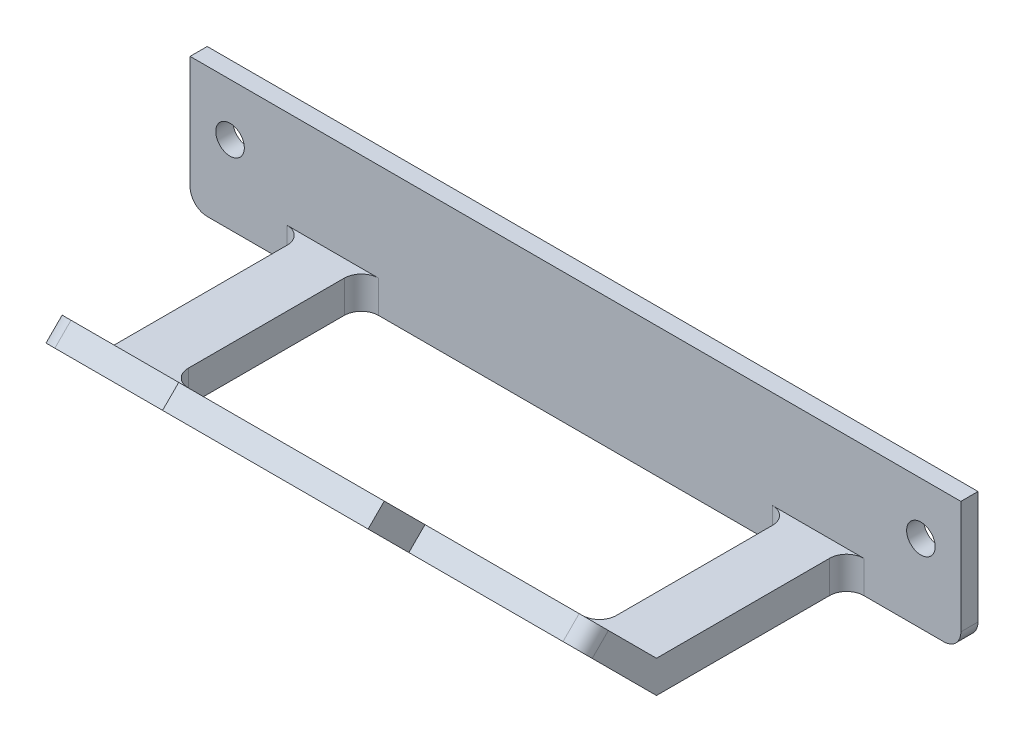
ISO-10303-21;
HEADER;
FILE_DESCRIPTION(('STEP AP214'),'2;1');
FILE_NAME('part.step','',(''),(''),'','','');
FILE_SCHEMA(('AUTOMOTIVE_DESIGN { 1 0 10303 214 1 1 1 1 }'));
ENDSEC;
DATA;
#1=APPLICATION_CONTEXT('core data for automotive mechanical design processes');
#2=APPLICATION_PROTOCOL_DEFINITION('international standard','automotive_design',2000,#1);
#3=PRODUCT_CONTEXT('',#1,'mechanical');
#4=PRODUCT('Part','Part','',(#3));
#5=PRODUCT_RELATED_PRODUCT_CATEGORY('part','',(#4));
#6=PRODUCT_DEFINITION_FORMATION('','',#4);
#7=PRODUCT_DEFINITION_CONTEXT('part definition',#1,'design');
#8=PRODUCT_DEFINITION('design','',#6,#7);
#9=PRODUCT_DEFINITION_SHAPE('','',#8);
#10=(LENGTH_UNIT() NAMED_UNIT(*) SI_UNIT(.MILLI.,.METRE.));
#11=(NAMED_UNIT(*) PLANE_ANGLE_UNIT() SI_UNIT($,.RADIAN.));
#12=(NAMED_UNIT(*) SI_UNIT($,.STERADIAN.) SOLID_ANGLE_UNIT());
#13=UNCERTAINTY_MEASURE_WITH_UNIT(LENGTH_MEASURE(1.E-05),#10,'distance_accuracy_value','');
#14=(GEOMETRIC_REPRESENTATION_CONTEXT(3) GLOBAL_UNCERTAINTY_ASSIGNED_CONTEXT((#13)) GLOBAL_UNIT_ASSIGNED_CONTEXT((#10,
#11,#12)) REPRESENTATION_CONTEXT('',''));
#15=CARTESIAN_POINT('',(0.,0.,0.));
#16=DIRECTION('',(0.,0.,1.));
#17=DIRECTION('',(1.,0.,0.));
#18=AXIS2_PLACEMENT_3D('',#15,#16,#17);
#19=CARTESIAN_POINT('',(35.,18.4852813742386,9.48528137423858));
#20=DIRECTION('',(0.,-1.,0.));
#21=DIRECTION('',(1.,0.,0.));
#22=AXIS2_PLACEMENT_3D('',#19,#20,#21);
#23=CYLINDRICAL_SURFACE('',#22,3.);
#24=DIRECTION('',(0.,1.,0.));
#25=VECTOR('',#24,1.);
#26=CARTESIAN_POINT('',(38.,18.4852813742386,9.48528137423858));
#27=LINE('',#26,#25);
#28=CARTESIAN_POINT('',(38.,18.4852813742386,9.48528137423858));
#29=VERTEX_POINT('',#28);
#30=CARTESIAN_POINT('',(38.,24.1421356237309,9.48528137423858));
#31=VERTEX_POINT('',#30);
#32=EDGE_CURVE('E543',#29,#31,#27,.T.);
#33=ORIENTED_EDGE('',*,*,#32,.F.);
#34=CARTESIAN_POINT('',(35.,18.4852813742386,9.48528137423858));
#35=DIRECTION('',(0.,1.,0.));
#36=DIRECTION('',(0.,0.,1.));
#37=AXIS2_PLACEMENT_3D('',#34,#35,#36);
#38=CIRCLE('',#37,3.);
#39=CARTESIAN_POINT('',(35.,18.4852813742386,12.4852813742386));
#40=VERTEX_POINT('',#39);
#41=EDGE_CURVE('E51',#29,#40,#38,.F.);
#42=ORIENTED_EDGE('',*,*,#41,.T.);
#43=DIRECTION('',(0.,1.,0.));
#44=VECTOR('',#43,1.);
#45=CARTESIAN_POINT('',(35.,18.4852813742386,12.4852813742386));
#46=LINE('',#45,#44);
#47=CARTESIAN_POINT('',(35.,24.1421356237309,12.4852813742386));
#48=VERTEX_POINT('',#47);
#49=EDGE_CURVE('E547',#48,#40,#46,.F.);
#50=ORIENTED_EDGE('',*,*,#49,.F.);
#51=CARTESIAN_POINT('',(35.,24.1421356237309,9.48528137423858));
#52=DIRECTION('',(0.,-1.,0.));
#53=DIRECTION('',(0.,0.,-1.));
#54=AXIS2_PLACEMENT_3D('',#51,#52,#53);
#55=CIRCLE('',#54,3.);
#56=EDGE_CURVE('E11',#48,#31,#55,.F.);
#57=ORIENTED_EDGE('',*,*,#56,.T.);
#58=EDGE_LOOP('',(#33,#42,#50,#57));
#59=FACE_BOUND('',#58,.T.);
#60=ADVANCED_FACE('F43',(#59),#23,.F.);
#61=CARTESIAN_POINT('',(-34.,18.4852813742386,9.48528137423858));
#62=DIRECTION('',(0.,-1.,0.));
#63=DIRECTION('',(0.,0.,-1.));
#64=AXIS2_PLACEMENT_3D('',#61,#62,#63);
#65=CYLINDRICAL_SURFACE('',#64,3.);
#66=DIRECTION('',(0.,1.,0.));
#67=VECTOR('',#66,1.);
#68=CARTESIAN_POINT('',(-34.,18.4852813742386,12.4852813742386));
#69=LINE('',#68,#67);
#70=CARTESIAN_POINT('',(-34.,18.4852813742386,12.4852813742386));
#71=VERTEX_POINT('',#70);
#72=CARTESIAN_POINT('',(-34.,24.1421356237309,12.4852813742386));
#73=VERTEX_POINT('',#72);
#74=EDGE_CURVE('E528',#71,#73,#69,.T.);
#75=ORIENTED_EDGE('',*,*,#74,.F.);
#76=CARTESIAN_POINT('',(-34.,18.4852813742386,9.48528137423858));
#77=DIRECTION('',(0.,1.,0.));
#78=DIRECTION('',(0.,0.,1.));
#79=AXIS2_PLACEMENT_3D('',#76,#77,#78);
#80=CIRCLE('',#79,3.);
#81=CARTESIAN_POINT('',(-37.,18.4852813742386,9.48528137423858));
#82=VERTEX_POINT('',#81);
#83=EDGE_CURVE('E536',#71,#82,#80,.F.);
#84=ORIENTED_EDGE('',*,*,#83,.T.);
#85=DIRECTION('',(0.,1.,0.));
#86=VECTOR('',#85,1.);
#87=CARTESIAN_POINT('',(-37.,18.4852813742386,9.48528137423858));
#88=LINE('',#87,#86);
#89=CARTESIAN_POINT('',(-37.,24.1421356237309,9.48528137423858));
#90=VERTEX_POINT('',#89);
#91=EDGE_CURVE('E532',#90,#82,#88,.F.);
#92=ORIENTED_EDGE('',*,*,#91,.F.);
#93=CARTESIAN_POINT('',(-34.,24.1421356237309,9.48528137423858));
#94=DIRECTION('',(0.,-1.,0.));
#95=DIRECTION('',(0.,0.,-1.));
#96=AXIS2_PLACEMENT_3D('',#93,#94,#95);
#97=CIRCLE('',#96,3.);
#98=EDGE_CURVE('E539',#90,#73,#97,.F.);
#99=ORIENTED_EDGE('',*,*,#98,.T.);
#100=EDGE_LOOP('',(#75,#84,#92,#99));
#101=FACE_BOUND('',#100,.T.);
#102=ADVANCED_FACE('F582',(#101),#65,.F.);
#103=CARTESIAN_POINT('',(35.,18.4852813742386,-17.8284271247462));
#104=DIRECTION('',(0.,-1.,0.));
#105=DIRECTION('',(1.,0.,0.));
#106=AXIS2_PLACEMENT_3D('',#103,#104,#105);
#107=CYLINDRICAL_SURFACE('',#106,3.);
#108=DIRECTION('',(0.,-1.,0.));
#109=VECTOR('',#108,1.);
#110=CARTESIAN_POINT('',(38.,18.4852813742386,-17.8284271247462));
#111=LINE('',#110,#109);
#112=CARTESIAN_POINT('',(38.,24.1421356237309,-17.8284271247462));
#113=VERTEX_POINT('',#112);
#114=CARTESIAN_POINT('',(38.,18.4852813742386,-17.8284271247462));
#115=VERTEX_POINT('',#114);
#116=EDGE_CURVE('E513',#113,#115,#111,.T.);
#117=ORIENTED_EDGE('',*,*,#116,.F.);
#118=CARTESIAN_POINT('',(35.,24.1421356237309,-17.8284271247462));
#119=DIRECTION('',(0.,-1.,0.));
#120=DIRECTION('',(0.,0.,-1.));
#121=AXIS2_PLACEMENT_3D('',#118,#119,#120);
#122=CIRCLE('',#121,3.);
#123=CARTESIAN_POINT('',(35.,24.1421356237309,-20.8284271247462));
#124=VERTEX_POINT('',#123);
#125=EDGE_CURVE('E521',#113,#124,#122,.F.);
#126=ORIENTED_EDGE('',*,*,#125,.T.);
#127=DIRECTION('',(0.,-1.,0.));
#128=VECTOR('',#127,1.);
#129=CARTESIAN_POINT('',(35.,0.,-20.8284271247462));
#130=LINE('',#129,#128);
#131=CARTESIAN_POINT('',(35.,18.4852813742385,-20.8284271247462));
#132=VERTEX_POINT('',#131);
#133=EDGE_CURVE('E517',#132,#124,#130,.F.);
#134=ORIENTED_EDGE('',*,*,#133,.F.);
#135=CARTESIAN_POINT('',(35.,18.4852813742386,-17.8284271247462));
#136=DIRECTION('',(0.,1.,0.));
#137=DIRECTION('',(0.,0.,1.));
#138=AXIS2_PLACEMENT_3D('',#135,#136,#137);
#139=CIRCLE('',#138,3.);
#140=EDGE_CURVE('E525',#132,#115,#139,.F.);
#141=ORIENTED_EDGE('',*,*,#140,.T.);
#142=EDGE_LOOP('',(#117,#126,#134,#141));
#143=FACE_BOUND('',#142,.T.);
#144=ADVANCED_FACE('F626',(#143),#107,.F.);
#145=CARTESIAN_POINT('',(-34.,18.4852813742386,-17.8284271247462));
#146=DIRECTION('',(0.,1.,0.));
#147=DIRECTION('',(0.,0.,1.));
#148=AXIS2_PLACEMENT_3D('',#145,#146,#147);
#149=CYLINDRICAL_SURFACE('',#148,3.);
#150=DIRECTION('',(0.,1.,0.));
#151=VECTOR('',#150,1.);
#152=CARTESIAN_POINT('',(-37.,18.4852813742386,-17.8284271247462));
#153=LINE('',#152,#151);
#154=CARTESIAN_POINT('',(-37.,18.4852813742386,-17.8284271247462));
#155=VERTEX_POINT('',#154);
#156=CARTESIAN_POINT('',(-37.,24.1421356237309,-17.8284271247462));
#157=VERTEX_POINT('',#156);
#158=EDGE_CURVE('E499',#155,#157,#153,.T.);
#159=ORIENTED_EDGE('',*,*,#158,.F.);
#160=CARTESIAN_POINT('',(-34.,18.4852813742386,-17.8284271247462));
#161=DIRECTION('',(0.,1.,0.));
#162=DIRECTION('',(0.,0.,1.));
#163=AXIS2_PLACEMENT_3D('',#160,#161,#162);
#164=CIRCLE('',#163,3.);
#165=CARTESIAN_POINT('',(-34.,18.4852813742385,-20.8284271247462));
#166=VERTEX_POINT('',#165);
#167=EDGE_CURVE('E507',#155,#166,#164,.F.);
#168=ORIENTED_EDGE('',*,*,#167,.T.);
#169=DIRECTION('',(0.,1.,0.));
#170=VECTOR('',#169,1.);
#171=CARTESIAN_POINT('',(-34.,0.,-20.8284271247462));
#172=LINE('',#171,#170);
#173=CARTESIAN_POINT('',(-34.,24.1421356237309,-20.8284271247462));
#174=VERTEX_POINT('',#173);
#175=EDGE_CURVE('E503',#174,#166,#172,.F.);
#176=ORIENTED_EDGE('',*,*,#175,.F.);
#177=CARTESIAN_POINT('',(-34.,24.1421356237309,-17.8284271247462));
#178=DIRECTION('',(0.,-1.,0.));
#179=DIRECTION('',(0.,0.,-1.));
#180=AXIS2_PLACEMENT_3D('',#177,#178,#179);
#181=CIRCLE('',#180,3.);
#182=EDGE_CURVE('E510',#174,#157,#181,.F.);
#183=ORIENTED_EDGE('',*,*,#182,.T.);
#184=EDGE_LOOP('',(#159,#168,#176,#183));
#185=FACE_BOUND('',#184,.T.);
#186=ADVANCED_FACE('F590',(#185),#149,.F.);
#187=CARTESIAN_POINT('',(-50.,0.,-17.8284271247462));
#188=DIRECTION('',(0.,-1.,0.));
#189=DIRECTION('',(0.,0.,-1.));
#190=AXIS2_PLACEMENT_3D('',#187,#188,#189);
#191=CYLINDRICAL_SURFACE('',#190,3.);
#192=DIRECTION('',(0.,-1.,0.));
#193=VECTOR('',#192,1.);
#194=CARTESIAN_POINT('',(-47.,0.,-17.8284271247462));
#195=LINE('',#194,#193);
#196=CARTESIAN_POINT('',(-47.,24.1421356237309,-17.8284271247462));
#197=VERTEX_POINT('',#196);
#198=CARTESIAN_POINT('',(-47.,18.4852813742386,-17.8284271247462));
#199=VERTEX_POINT('',#198);
#200=EDGE_CURVE('E484',#197,#199,#195,.T.);
#201=ORIENTED_EDGE('',*,*,#200,.F.);
#202=CARTESIAN_POINT('',(-50.,24.1421356237309,-17.8284271247462));
#203=DIRECTION('',(0.,-1.,0.));
#204=DIRECTION('',(0.,0.,-1.));
#205=AXIS2_PLACEMENT_3D('',#202,#203,#204);
#206=CIRCLE('',#205,3.);
#207=CARTESIAN_POINT('',(-50.,24.1421356237309,-20.8284271247462));
#208=VERTEX_POINT('',#207);
#209=EDGE_CURVE('E492',#197,#208,#206,.F.);
#210=ORIENTED_EDGE('',*,*,#209,.T.);
#211=DIRECTION('',(0.,-1.,0.));
#212=VECTOR('',#211,1.);
#213=CARTESIAN_POINT('',(-50.,0.,-20.8284271247462));
#214=LINE('',#213,#212);
#215=CARTESIAN_POINT('',(-50.,18.4852813742386,-20.8284271247462));
#216=VERTEX_POINT('',#215);
#217=EDGE_CURVE('E488',#216,#208,#214,.F.);
#218=ORIENTED_EDGE('',*,*,#217,.F.);
#219=CARTESIAN_POINT('',(-50.,18.4852813742386,-17.8284271247462));
#220=DIRECTION('',(0.,1.,0.));
#221=DIRECTION('',(0.,0.,1.));
#222=AXIS2_PLACEMENT_3D('',#219,#220,#221);
#223=CIRCLE('',#222,3.);
#224=EDGE_CURVE('E496',#216,#199,#223,.F.);
#225=ORIENTED_EDGE('',*,*,#224,.T.);
#226=EDGE_LOOP('',(#201,#210,#218,#225));
#227=FACE_BOUND('',#226,.T.);
#228=ADVANCED_FACE('F635',(#227),#191,.F.);
#229=CARTESIAN_POINT('',(51.,0.,-17.8284271247462));
#230=DIRECTION('',(0.,-1.,0.));
#231=DIRECTION('',(0.,0.,-1.));
#232=AXIS2_PLACEMENT_3D('',#229,#230,#231);
#233=CYLINDRICAL_SURFACE('',#232,3.);
#234=DIRECTION('',(0.,1.,0.));
#235=VECTOR('',#234,1.);
#236=CARTESIAN_POINT('',(48.,0.,-17.8284271247462));
#237=LINE('',#236,#235);
#238=CARTESIAN_POINT('',(48.,18.4852813742386,-17.8284271247462));
#239=VERTEX_POINT('',#238);
#240=CARTESIAN_POINT('',(48.,24.1421356237309,-17.8284271247462));
#241=VERTEX_POINT('',#240);
#242=EDGE_CURVE('E470',#239,#241,#237,.T.);
#243=ORIENTED_EDGE('',*,*,#242,.F.);
#244=CARTESIAN_POINT('',(51.,18.4852813742386,-17.8284271247462));
#245=DIRECTION('',(0.,1.,0.));
#246=DIRECTION('',(0.,0.,1.));
#247=AXIS2_PLACEMENT_3D('',#244,#245,#246);
#248=CIRCLE('',#247,3.);
#249=CARTESIAN_POINT('',(51.,18.4852813742386,-20.8284271247462));
#250=VERTEX_POINT('',#249);
#251=EDGE_CURVE('E478',#239,#250,#248,.F.);
#252=ORIENTED_EDGE('',*,*,#251,.T.);
#253=DIRECTION('',(0.,1.,0.));
#254=VECTOR('',#253,1.);
#255=CARTESIAN_POINT('',(51.,0.,-20.8284271247462));
#256=LINE('',#255,#254);
#257=CARTESIAN_POINT('',(51.,24.1421356237309,-20.8284271247462));
#258=VERTEX_POINT('',#257);
#259=EDGE_CURVE('E474',#258,#250,#256,.F.);
#260=ORIENTED_EDGE('',*,*,#259,.F.);
#261=CARTESIAN_POINT('',(51.,24.1421356237309,-17.8284271247462));
#262=DIRECTION('',(0.,-1.,0.));
#263=DIRECTION('',(0.,0.,-1.));
#264=AXIS2_PLACEMENT_3D('',#261,#262,#263);
#265=CIRCLE('',#264,3.);
#266=EDGE_CURVE('E481',#258,#241,#265,.F.);
#267=ORIENTED_EDGE('',*,*,#266,.T.);
#268=EDGE_LOOP('',(#243,#252,#260,#267));
#269=FACE_BOUND('',#268,.T.);
#270=ADVANCED_FACE('F638',(#269),#233,.F.);
#271=CARTESIAN_POINT('',(-64.,21.4852813742386,-20.8284271247462));
#272=DIRECTION('',(0.,0.,-1.));
#273=DIRECTION('',(-1.,0.,0.));
#274=AXIS2_PLACEMENT_3D('',#271,#272,#273);
#275=CYLINDRICAL_SURFACE('',#274,3.);
#276=DIRECTION('',(0.,0.,1.));
#277=VECTOR('',#276,1.);
#278=CARTESIAN_POINT('',(-67.,21.4852813742386,-20.8284271247462));
#279=LINE('',#278,#277);
#280=CARTESIAN_POINT('',(-67.,21.4852813742386,-23.8284271247462));
#281=VERTEX_POINT('',#280);
#282=CARTESIAN_POINT('',(-67.,21.4852813742386,-20.8284271247462));
#283=VERTEX_POINT('',#282);
#284=EDGE_CURVE('E457',#281,#283,#279,.T.);
#285=ORIENTED_EDGE('',*,*,#284,.F.);
#286=CARTESIAN_POINT('',(-64.,21.4852813742386,-23.8284271247462));
#287=DIRECTION('',(0.,0.,-1.));
#288=DIRECTION('',(-1.,0.,0.));
#289=AXIS2_PLACEMENT_3D('',#286,#287,#288);
#290=CIRCLE('',#289,3.);
#291=CARTESIAN_POINT('',(-64.,18.4852813742386,-23.8284271247462));
#292=VERTEX_POINT('',#291);
#293=EDGE_CURVE('E233',#292,#281,#290,.T.);
#294=ORIENTED_EDGE('',*,*,#293,.F.);
#295=DIRECTION('',(0.,0.,1.));
#296=VECTOR('',#295,1.);
#297=CARTESIAN_POINT('',(-64.,18.4852813742386,-20.8284271247462));
#298=LINE('',#297,#296);
#299=CARTESIAN_POINT('',(-64.,18.4852813742386,-20.8284271247462));
#300=VERTEX_POINT('',#299);
#301=EDGE_CURVE('E460',#300,#292,#298,.F.);
#302=ORIENTED_EDGE('',*,*,#301,.F.);
#303=CARTESIAN_POINT('',(-64.,21.4852813742386,-20.8284271247462));
#304=DIRECTION('',(0.,0.,1.));
#305=DIRECTION('',(1.,0.,0.));
#306=AXIS2_PLACEMENT_3D('',#303,#304,#305);
#307=CIRCLE('',#306,3.);
#308=EDGE_CURVE('E466',#283,#300,#307,.T.);
#309=ORIENTED_EDGE('',*,*,#308,.F.);
#310=EDGE_LOOP('',(#285,#294,#302,#309));
#311=FACE_BOUND('',#310,.T.);
#312=ADVANCED_FACE('F642',(#311),#275,.T.);
#313=CARTESIAN_POINT('',(65.,21.4852813742386,-20.8284271247462));
#314=DIRECTION('',(0.,0.,1.));
#315=DIRECTION('',(1.,0.,0.));
#316=AXIS2_PLACEMENT_3D('',#313,#314,#315);
#317=CYLINDRICAL_SURFACE('',#316,3.);
#318=DIRECTION('',(0.,0.,-1.));
#319=VECTOR('',#318,1.);
#320=CARTESIAN_POINT('',(68.,21.4852813742386,-20.8284271247462));
#321=LINE('',#320,#319);
#322=CARTESIAN_POINT('',(68.,21.4852813742386,-20.8284271247462));
#323=VERTEX_POINT('',#322);
#324=CARTESIAN_POINT('',(68.,21.4852813742386,-23.8284271247462));
#325=VERTEX_POINT('',#324);
#326=EDGE_CURVE('E443',#323,#325,#321,.T.);
#327=ORIENTED_EDGE('',*,*,#326,.F.);
#328=CARTESIAN_POINT('',(65.,21.4852813742386,-20.8284271247462));
#329=DIRECTION('',(0.,0.,1.));
#330=DIRECTION('',(1.,0.,0.));
#331=AXIS2_PLACEMENT_3D('',#328,#329,#330);
#332=CIRCLE('',#331,3.);
#333=CARTESIAN_POINT('',(65.,18.4852813742386,-20.8284271247462));
#334=VERTEX_POINT('',#333);
#335=EDGE_CURVE('E451',#334,#323,#332,.T.);
#336=ORIENTED_EDGE('',*,*,#335,.F.);
#337=DIRECTION('',(0.,0.,-1.));
#338=VECTOR('',#337,1.);
#339=CARTESIAN_POINT('',(65.,18.4852813742386,-20.8284271247462));
#340=LINE('',#339,#338);
#341=CARTESIAN_POINT('',(65.,18.4852813742386,-23.8284271247462));
#342=VERTEX_POINT('',#341);
#343=EDGE_CURVE('E447',#342,#334,#340,.F.);
#344=ORIENTED_EDGE('',*,*,#343,.F.);
#345=CARTESIAN_POINT('',(65.,21.4852813742386,-23.8284271247462));
#346=DIRECTION('',(0.,0.,-1.));
#347=DIRECTION('',(-1.,0.,0.));
#348=AXIS2_PLACEMENT_3D('',#345,#346,#347);
#349=CIRCLE('',#348,3.);
#350=EDGE_CURVE('E454',#325,#342,#349,.T.);
#351=ORIENTED_EDGE('',*,*,#350,.F.);
#352=EDGE_LOOP('',(#327,#336,#344,#351));
#353=FACE_BOUND('',#352,.T.);
#354=ADVANCED_FACE('F646',(#353),#317,.T.);
#355=CARTESIAN_POINT('',(-37.,18.4852813742386,-35.3175524178222));
#356=DIRECTION('',(-1.,0.,0.));
#357=DIRECTION('',(0.,0.,1.));
#358=AXIS2_PLACEMENT_3D('',#355,#356,#357);
#359=PLANE('',#358);
#360=DIRECTION('',(0.,0.,1.));
#361=VECTOR('',#360,1.);
#362=CARTESIAN_POINT('',(-37.,24.1421356237309,-35.3175524178222));
#363=LINE('',#362,#361);
#364=EDGE_CURVE('E310',#157,#90,#363,.T.);
#365=ORIENTED_EDGE('',*,*,#364,.T.);
#366=ORIENTED_EDGE('',*,*,#91,.T.);
#367=DIRECTION('',(0.,0.,1.));
#368=VECTOR('',#367,1.);
#369=CARTESIAN_POINT('',(-37.,18.4852813742386,-35.3175524178222));
#370=LINE('',#369,#368);
#371=EDGE_CURVE('E316',#155,#82,#370,.T.);
#372=ORIENTED_EDGE('',*,*,#371,.F.);
#373=ORIENTED_EDGE('',*,*,#158,.T.);
#374=EDGE_LOOP('',(#365,#366,#372,#373));
#375=FACE_BOUND('',#374,.T.);
#376=ADVANCED_FACE('F585',(#375),#359,.F.);
#377=CARTESIAN_POINT('',(38.,18.4852813742386,-35.3175524178222));
#378=DIRECTION('',(1.,0.,0.));
#379=DIRECTION('',(0.,1.,0.));
#380=AXIS2_PLACEMENT_3D('',#377,#378,#379);
#381=PLANE('',#380);
#382=DIRECTION('',(0.,0.,1.));
#383=VECTOR('',#382,1.);
#384=CARTESIAN_POINT('',(38.,18.4852813742386,-35.3175524178222));
#385=LINE('',#384,#383);
#386=EDGE_CURVE('E300',#115,#29,#385,.T.);
#387=ORIENTED_EDGE('',*,*,#386,.T.);
#388=ORIENTED_EDGE('',*,*,#32,.T.);
#389=DIRECTION('',(0.,0.,1.));
#390=VECTOR('',#389,1.);
#391=CARTESIAN_POINT('',(38.,24.1421356237309,-35.3175524178222));
#392=LINE('',#391,#390);
#393=EDGE_CURVE('E291',#113,#31,#392,.T.);
#394=ORIENTED_EDGE('',*,*,#393,.F.);
#395=ORIENTED_EDGE('',*,*,#116,.T.);
#396=EDGE_LOOP('',(#387,#388,#394,#395));
#397=FACE_BOUND('',#396,.T.);
#398=ADVANCED_FACE('F655',(#397),#381,.F.);
#399=CARTESIAN_POINT('',(-44.,32.5641189689202,20.9072647194278));
#400=DIRECTION('',(0.,0.707106781186547,-0.707106781186548));
#401=DIRECTION('',(0.,0.707106781186548,0.707106781186547));
#402=AXIS2_PLACEMENT_3D('',#399,#400,#401);
#403=CYLINDRICAL_SURFACE('',#402,3.);
#404=DIRECTION('',(0.,-0.707106781186547,0.707106781186548));
#405=VECTOR('',#404,1.);
#406=CARTESIAN_POINT('',(-44.,34.6854393124798,23.0285850629875));
#407=LINE('',#406,#405);
#408=CARTESIAN_POINT('',(-44.,34.6854393124798,23.0285850629875));
#409=VERTEX_POINT('',#408);
#410=CARTESIAN_POINT('',(-44.,31.8570121877336,25.8570121877337));
#411=VERTEX_POINT('',#410);
#412=EDGE_CURVE('E429',#409,#411,#407,.T.);
#413=ORIENTED_EDGE('',*,*,#412,.F.);
#414=CARTESIAN_POINT('',(-44.,32.5641189689201,20.9072647194278));
#415=DIRECTION('',(0.,-0.707106781186549,0.707106781186546));
#416=DIRECTION('',(0.,-0.707106781186546,-0.707106781186549));
#417=AXIS2_PLACEMENT_3D('',#414,#415,#416);
#418=CIRCLE('',#417,3.);
#419=CARTESIAN_POINT('',(-47.,32.5641189689202,20.9072647194278));
#420=VERTEX_POINT('',#419);
#421=EDGE_CURVE('E437',#420,#409,#418,.F.);
#422=ORIENTED_EDGE('',*,*,#421,.F.);
#423=DIRECTION('',(0.,-0.707106781186547,0.707106781186548));
#424=VECTOR('',#423,1.);
#425=CARTESIAN_POINT('',(-47.,32.5641189689202,20.9072647194278));
#426=LINE('',#425,#424);
#427=CARTESIAN_POINT('',(-47.,29.735691844174,23.735691844174));
#428=VERTEX_POINT('',#427);
#429=EDGE_CURVE('E433',#428,#420,#426,.F.);
#430=ORIENTED_EDGE('',*,*,#429,.F.);
#431=CARTESIAN_POINT('',(-44.,29.735691844174,23.735691844174));
#432=DIRECTION('',(0.,0.707106781186549,-0.707106781186546));
#433=DIRECTION('',(0.,0.707106781186546,0.707106781186549));
#434=AXIS2_PLACEMENT_3D('',#431,#432,#433);
#435=CIRCLE('',#434,3.);
#436=EDGE_CURVE('E440',#411,#428,#435,.F.);
#437=ORIENTED_EDGE('',*,*,#436,.F.);
#438=EDGE_LOOP('',(#413,#422,#430,#437));
#439=FACE_BOUND('',#438,.T.);
#440=ADVANCED_FACE('F651',(#439),#403,.T.);
#441=CARTESIAN_POINT('',(45.,32.5641189689202,20.9072647194278));
#442=DIRECTION('',(0.,0.707106781186547,-0.707106781186548));
#443=DIRECTION('',(0.,0.707106781186548,0.707106781186547));
#444=AXIS2_PLACEMENT_3D('',#441,#442,#443);
#445=CYLINDRICAL_SURFACE('',#444,3.);
#446=DIRECTION('',(0.,0.707106781186547,-0.707106781186548));
#447=VECTOR('',#446,1.);
#448=CARTESIAN_POINT('',(45.,34.6854393124798,23.0285850629875));
#449=LINE('',#448,#447);
#450=CARTESIAN_POINT('',(45.,31.8570121877336,25.8570121877337));
#451=VERTEX_POINT('',#450);
#452=CARTESIAN_POINT('',(45.,34.6854393124798,23.0285850629875));
#453=VERTEX_POINT('',#452);
#454=EDGE_CURVE('E411',#451,#453,#449,.T.);
#455=ORIENTED_EDGE('',*,*,#454,.F.);
#456=CARTESIAN_POINT('',(45.,29.735691844174,23.735691844174));
#457=DIRECTION('',(0.,0.707106781186549,-0.707106781186546));
#458=DIRECTION('',(0.,0.707106781186546,0.707106781186549));
#459=AXIS2_PLACEMENT_3D('',#456,#457,#458);
#460=CIRCLE('',#459,3.);
#461=CARTESIAN_POINT('',(48.,29.735691844174,23.735691844174));
#462=VERTEX_POINT('',#461);
#463=EDGE_CURVE('E423',#462,#451,#460,.F.);
#464=ORIENTED_EDGE('',*,*,#463,.F.);
#465=DIRECTION('',(0.,0.707106781186547,-0.707106781186548));
#466=VECTOR('',#465,1.);
#467=CARTESIAN_POINT('',(48.,26.735691844174,26.735691844174));
#468=LINE('',#467,#466);
#469=CARTESIAN_POINT('',(48.,32.5641189689202,20.9072647194278));
#470=VERTEX_POINT('',#469);
#471=EDGE_CURVE('E419',#470,#462,#468,.F.);
#472=ORIENTED_EDGE('',*,*,#471,.F.);
#473=CARTESIAN_POINT('',(45.,32.5641189689201,20.9072647194278));
#474=DIRECTION('',(0.,-0.707106781186549,0.707106781186546));
#475=DIRECTION('',(0.,-0.707106781186546,-0.707106781186549));
#476=AXIS2_PLACEMENT_3D('',#473,#474,#475);
#477=CIRCLE('',#476,3.);
#478=EDGE_CURVE('E426',#453,#470,#477,.F.);
#479=ORIENTED_EDGE('',*,*,#478,.F.);
#480=EDGE_LOOP('',(#455,#464,#472,#479));
#481=FACE_BOUND('',#480,.T.);
#482=ADVANCED_FACE('F654',(#481),#445,.T.);
#483=CARTESIAN_POINT('',(-11.6754446796632,18.4852813742386,12.4852813742386));
#484=DIRECTION('',(0.,0.,1.));
#485=DIRECTION('',(1.,0.,0.));
#486=AXIS2_PLACEMENT_3D('',#483,#484,#485);
#487=PLANE('',#486);
#488=DIRECTION('',(-1.,0.,0.));
#489=VECTOR('',#488,1.);
#490=CARTESIAN_POINT('',(-11.6754446796632,24.1421356237309,12.4852813742386));
#491=LINE('',#490,#489);
#492=EDGE_CURVE('E315',#48,#73,#491,.T.);
#493=ORIENTED_EDGE('',*,*,#492,.F.);
#494=ORIENTED_EDGE('',*,*,#49,.T.);
#495=DIRECTION('',(1.,0.,0.));
#496=VECTOR('',#495,1.);
#497=CARTESIAN_POINT('',(-47.,18.4852813742386,12.4852813742386));
#498=LINE('',#497,#496);
#499=EDGE_CURVE('E347',#71,#40,#498,.T.);
#500=ORIENTED_EDGE('',*,*,#499,.F.);
#501=ORIENTED_EDGE('',*,*,#74,.T.);
#502=EDGE_LOOP('',(#493,#494,#500,#501));
#503=FACE_BOUND('',#502,.T.);
#504=ADVANCED_FACE('F558',(#503),#487,.F.);
#505=CARTESIAN_POINT('',(-18.,0.,0.));
#506=DIRECTION('',(-1.,0.,0.));
#507=DIRECTION('',(0.,0.,1.));
#508=AXIS2_PLACEMENT_3D('',#505,#506,#507);
#509=PLANE('',#508);
#510=DIRECTION('',(0.,0.707106781186547,-0.707106781186548));
#511=VECTOR('',#510,1.);
#512=CARTESIAN_POINT('',(-18.,28.8570121877337,28.8570121877336));
#513=LINE('',#512,#511);
#514=CARTESIAN_POINT('',(-18.,31.8570121877336,25.8570121877337));
#515=VERTEX_POINT('',#514);
#516=CARTESIAN_POINT('',(-18.,34.6854393124798,23.0285850629875));
#517=VERTEX_POINT('',#516);
#518=EDGE_CURVE('E404',#515,#517,#513,.T.);
#519=ORIENTED_EDGE('',*,*,#518,.F.);
#520=DIRECTION('',(0.,-0.707106781186546,-0.707106781186549));
#521=VECTOR('',#520,1.);
#522=CARTESIAN_POINT('',(-18.,10.,4.));
#523=LINE('',#522,#521);
#524=CARTESIAN_POINT('',(-18.,38.9913780286484,32.9913780286485));
#525=VERTEX_POINT('',#524);
#526=EDGE_CURVE('E382',#525,#515,#523,.T.);
#527=ORIENTED_EDGE('',*,*,#526,.F.);
#528=DIRECTION('',(0.,-0.707106781186549,0.707106781186546));
#529=VECTOR('',#528,1.);
#530=CARTESIAN_POINT('',(-18.,38.9913780286484,32.9913780286485));
#531=LINE('',#530,#529);
#532=CARTESIAN_POINT('',(-18.,41.8198051533946,30.1629509039023));
#533=VERTEX_POINT('',#532);
#534=EDGE_CURVE('E391',#533,#525,#531,.T.);
#535=ORIENTED_EDGE('',*,*,#534,.F.);
#536=DIRECTION('',(0.,0.707106781186546,0.707106781186549));
#537=VECTOR('',#536,1.);
#538=CARTESIAN_POINT('',(-18.,41.8198051533946,30.1629509039023));
#539=LINE('',#538,#537);
#540=EDGE_CURVE('E377',#517,#533,#539,.T.);
#541=ORIENTED_EDGE('',*,*,#540,.F.);
#542=EDGE_LOOP('',(#519,#527,#535,#541));
#543=FACE_BOUND('',#542,.T.);
#544=ADVANCED_FACE('F670',(#543),#509,.T.);
#545=CARTESIAN_POINT('',(12.7215906142792,52.6504927750292,10.8306876216346));
#546=DIRECTION('',(0.,-0.707106781186549,0.707106781186546));
#547=DIRECTION('',(0.,-0.707106781186546,-0.707106781186549));
#548=AXIS2_PLACEMENT_3D('',#545,#546,#547);
#549=CYLINDRICAL_SURFACE('',#548,1.5);
#550=CARTESIAN_POINT('',(12.7215906142792,37.569017323078,25.9121630735857));
#551=DIRECTION('',(0.,-0.707106781186549,0.707106781186546));
#552=DIRECTION('',(0.,-0.707106781186546,-0.707106781186549));
#553=AXIS2_PLACEMENT_3D('',#550,#551,#552);
#554=CIRCLE('',#553,1.5);
#555=CARTESIAN_POINT('',(12.7215906142792,36.5083571512982,24.8515029018059));
#556=VERTEX_POINT('',#555);
#557=EDGE_CURVE('E373',#556,#556,#554,.T.);
#558=ORIENTED_EDGE('',*,*,#557,.F.);
#559=EDGE_LOOP('',(#558));
#560=FACE_BOUND('',#559,.T.);
#561=CARTESIAN_POINT('',(12.7215906142792,36.1548037607049,27.3263766359588));
#562=DIRECTION('',(0.,-0.707106781186549,0.707106781186546));
#563=DIRECTION('',(0.,-0.707106781186546,-0.707106781186549));
#564=AXIS2_PLACEMENT_3D('',#561,#562,#563);
#565=CIRCLE('',#564,1.5);
#566=CARTESIAN_POINT('',(12.7215906142792,35.0941435889251,26.265716464179));
#567=VERTEX_POINT('',#566);
#568=EDGE_CURVE('E367',#567,#567,#565,.F.);
#569=ORIENTED_EDGE('',*,*,#568,.F.);
#570=EDGE_LOOP('',(#569));
#571=FACE_BOUND('',#570,.T.);
#572=ADVANCED_FACE('F663',(#560,#571),#549,.F.);
#573=CARTESIAN_POINT('',(18.,41.8198051533946,30.1629509039023));
#574=DIRECTION('',(0.,-0.707106781186549,0.707106781186546));
#575=DIRECTION('',(0.,-0.707106781186546,-0.707106781186549));
#576=AXIS2_PLACEMENT_3D('',#573,#574,#575);
#577=PLANE('',#576);
#578=DIRECTION('',(0.,0.707106781186548,0.707106781186547));
#579=VECTOR('',#578,1.);
#580=CARTESIAN_POINT('',(-47.,21.3137084989847,9.6568542494924));
#581=LINE('',#580,#579);
#582=CARTESIAN_POINT('',(-47.,24.1421356237309,12.4852813742386));
#583=VERTEX_POINT('',#582);
#584=EDGE_CURVE('E343',#583,#420,#581,.T.);
#585=ORIENTED_EDGE('',*,*,#584,.T.);
#586=ORIENTED_EDGE('',*,*,#421,.T.);
#587=DIRECTION('',(1.,0.,0.));
#588=VECTOR('',#587,1.);
#589=CARTESIAN_POINT('',(-47.,34.6854393124798,23.0285850629875));
#590=LINE('',#589,#588);
#591=EDGE_CURVE('E353',#409,#517,#590,.T.);
#592=ORIENTED_EDGE('',*,*,#591,.T.);
#593=ORIENTED_EDGE('',*,*,#540,.T.);
#594=DIRECTION('',(-1.,0.,0.));
#595=VECTOR('',#594,1.);
#596=CARTESIAN_POINT('',(18.,41.8198051533946,30.1629509039023));
#597=LINE('',#596,#595);
#598=CARTESIAN_POINT('',(18.,41.8198051533946,30.1629509039023));
#599=VERTEX_POINT('',#598);
#600=EDGE_CURVE('E400',#599,#533,#597,.T.);
#601=ORIENTED_EDGE('',*,*,#600,.F.);
#602=DIRECTION('',(0.,0.707106781186546,0.707106781186549));
#603=VECTOR('',#602,1.);
#604=CARTESIAN_POINT('',(18.,41.8198051533946,30.1629509039023));
#605=LINE('',#604,#603);
#606=CARTESIAN_POINT('',(18.,34.6854393124798,23.0285850629875));
#607=VERTEX_POINT('',#606);
#608=EDGE_CURVE('E378',#607,#599,#605,.T.);
#609=ORIENTED_EDGE('',*,*,#608,.F.);
#610=EDGE_CURVE('E356',#607,#453,#590,.T.);
#611=ORIENTED_EDGE('',*,*,#610,.T.);
#612=ORIENTED_EDGE('',*,*,#478,.T.);
#613=DIRECTION('',(0.,0.707106781186548,0.707106781186547));
#614=VECTOR('',#613,1.);
#615=CARTESIAN_POINT('',(48.,21.3137084989847,9.6568542494924));
#616=LINE('',#615,#614);
#617=CARTESIAN_POINT('',(48.,24.1421356237309,12.4852813742386));
#618=VERTEX_POINT('',#617);
#619=EDGE_CURVE('E335',#618,#470,#616,.T.);
#620=ORIENTED_EDGE('',*,*,#619,.F.);
#621=EDGE_CURVE('E327',#618,#48,#491,.T.);
#622=ORIENTED_EDGE('',*,*,#621,.T.);
#623=ORIENTED_EDGE('',*,*,#492,.T.);
#624=DIRECTION('',(1.,0.,0.));
#625=VECTOR('',#624,1.);
#626=CARTESIAN_POINT('',(-47.,24.1421356237309,12.4852813742386));
#627=LINE('',#626,#625);
#628=EDGE_CURVE('E306',#583,#73,#627,.T.);
#629=ORIENTED_EDGE('',*,*,#628,.F.);
#630=EDGE_LOOP('',(#585,#586,#592,#593,#601,#609,#611,#612,#620,#622,#623,#629));
#631=FACE_BOUND('',#630,.T.);
#632=ORIENTED_EDGE('',*,*,#557,.T.);
#633=EDGE_LOOP('',(#632));
#634=FACE_BOUND('',#633,.T.);
#635=ADVANCED_FACE('F571',(#631,#634),#577,.F.);
#636=CARTESIAN_POINT('',(18.,38.9913780286484,32.9913780286485));
#637=DIRECTION('',(0.,-0.707106781186546,-0.707106781186549));
#638=DIRECTION('',(0.,0.707106781186549,-0.707106781186546));
#639=AXIS2_PLACEMENT_3D('',#636,#637,#638);
#640=PLANE('',#639);
#641=ORIENTED_EDGE('',*,*,#534,.T.);
#642=DIRECTION('',(-1.,0.,0.));
#643=VECTOR('',#642,1.);
#644=CARTESIAN_POINT('',(18.,38.9913780286484,32.9913780286485));
#645=LINE('',#644,#643);
#646=CARTESIAN_POINT('',(18.,38.9913780286484,32.9913780286485));
#647=VERTEX_POINT('',#646);
#648=EDGE_CURVE('E388',#647,#525,#645,.T.);
#649=ORIENTED_EDGE('',*,*,#648,.F.);
#650=DIRECTION('',(0.,-0.707106781186549,0.707106781186546));
#651=VECTOR('',#650,1.);
#652=CARTESIAN_POINT('',(18.,38.9913780286484,32.9913780286485));
#653=LINE('',#652,#651);
#654=EDGE_CURVE('E381',#599,#647,#653,.T.);
#655=ORIENTED_EDGE('',*,*,#654,.F.);
#656=ORIENTED_EDGE('',*,*,#600,.T.);
#657=EDGE_LOOP('',(#641,#649,#655,#656));
#658=FACE_BOUND('',#657,.T.);
#659=ADVANCED_FACE('F662',(#658),#640,.F.);
#660=CARTESIAN_POINT('',(18.,10.,4.));
#661=DIRECTION('',(0.,0.707106781186549,-0.707106781186546));
#662=DIRECTION('',(0.,0.707106781186546,0.707106781186549));
#663=AXIS2_PLACEMENT_3D('',#660,#661,#662);
#664=PLANE('',#663);
#665=DIRECTION('',(1.,0.,0.));
#666=VECTOR('',#665,1.);
#667=CARTESIAN_POINT('',(-47.,31.8570121877336,25.8570121877337));
#668=LINE('',#667,#666);
#669=EDGE_CURVE('E348',#411,#515,#668,.T.);
#670=ORIENTED_EDGE('',*,*,#669,.F.);
#671=ORIENTED_EDGE('',*,*,#436,.T.);
#672=DIRECTION('',(0.,-0.707106781186547,-0.707106781186548));
#673=VECTOR('',#672,1.);
#674=CARTESIAN_POINT('',(-47.,31.8570121877336,25.8570121877337));
#675=LINE('',#674,#673);
#676=CARTESIAN_POINT('',(-47.,18.4852813742386,12.4852813742386));
#677=VERTEX_POINT('',#676);
#678=EDGE_CURVE('E339',#428,#677,#675,.T.);
#679=ORIENTED_EDGE('',*,*,#678,.T.);
#680=EDGE_CURVE('E357',#677,#71,#498,.T.);
#681=ORIENTED_EDGE('',*,*,#680,.T.);
#682=ORIENTED_EDGE('',*,*,#499,.T.);
#683=DIRECTION('',(-1.,0.,0.));
#684=VECTOR('',#683,1.);
#685=CARTESIAN_POINT('',(18.,18.4852813742386,12.4852813742386));
#686=LINE('',#685,#684);
#687=CARTESIAN_POINT('',(48.,18.4852813742386,12.4852813742386));
#688=VERTEX_POINT('',#687);
#689=EDGE_CURVE('E64',#688,#40,#686,.T.);
#690=ORIENTED_EDGE('',*,*,#689,.F.);
#691=DIRECTION('',(0.,-0.707106781186547,-0.707106781186548));
#692=VECTOR('',#691,1.);
#693=CARTESIAN_POINT('',(48.,31.8570121877336,25.8570121877337));
#694=LINE('',#693,#692);
#695=EDGE_CURVE('E331',#462,#688,#694,.T.);
#696=ORIENTED_EDGE('',*,*,#695,.F.);
#697=ORIENTED_EDGE('',*,*,#463,.T.);
#698=CARTESIAN_POINT('',(18.,31.8570121877336,25.8570121877337));
#699=VERTEX_POINT('',#698);
#700=EDGE_CURVE('E352',#699,#451,#668,.T.);
#701=ORIENTED_EDGE('',*,*,#700,.F.);
#702=DIRECTION('',(0.,-0.707106781186546,-0.707106781186549));
#703=VECTOR('',#702,1.);
#704=CARTESIAN_POINT('',(18.,10.,4.));
#705=LINE('',#704,#703);
#706=EDGE_CURVE('E385',#647,#699,#705,.T.);
#707=ORIENTED_EDGE('',*,*,#706,.F.);
#708=ORIENTED_EDGE('',*,*,#648,.T.);
#709=ORIENTED_EDGE('',*,*,#526,.T.);
#710=EDGE_LOOP('',(#670,#671,#679,#681,#682,#690,#696,#697,#701,#707,#708,#709));
#711=FACE_BOUND('',#710,.T.);
#712=CARTESIAN_POINT('',(12.7215906142792,34.7405901983318,28.7405901983319));
#713=DIRECTION('',(0.,-0.707106781186549,0.707106781186546));
#714=DIRECTION('',(0.,-0.707106781186546,-0.707106781186549));
#715=AXIS2_PLACEMENT_3D('',#712,#713,#714);
#716=CIRCLE('',#715,2.5);
#717=CARTESIAN_POINT('',(12.7215906142792,32.9728232453654,26.9728232453655));
#718=VERTEX_POINT('',#717);
#719=EDGE_CURVE('E362',#718,#718,#716,.T.);
#720=ORIENTED_EDGE('',*,*,#719,.F.);
#721=EDGE_LOOP('',(#720));
#722=FACE_BOUND('',#721,.T.);
#723=ADVANCED_FACE('F561',(#711,#722),#664,.F.);
#724=CARTESIAN_POINT('',(18.,0.,0.));
#725=DIRECTION('',(-1.,0.,0.));
#726=DIRECTION('',(0.,0.,1.));
#727=AXIS2_PLACEMENT_3D('',#724,#725,#726);
#728=PLANE('',#727);
#729=ORIENTED_EDGE('',*,*,#706,.T.);
#730=DIRECTION('',(0.,0.707106781186547,-0.707106781186548));
#731=VECTOR('',#730,1.);
#732=CARTESIAN_POINT('',(18.,28.8570121877337,28.8570121877336));
#733=LINE('',#732,#731);
#734=EDGE_CURVE('E351',#699,#607,#733,.T.);
#735=ORIENTED_EDGE('',*,*,#734,.T.);
#736=ORIENTED_EDGE('',*,*,#608,.T.);
#737=ORIENTED_EDGE('',*,*,#654,.T.);
#738=EDGE_LOOP('',(#729,#735,#736,#737));
#739=FACE_BOUND('',#738,.T.);
#740=ADVANCED_FACE('F669',(#739),#728,.F.);
#741=CARTESIAN_POINT('',(12.7215906142792,36.1548037607049,27.3263766359588));
#742=DIRECTION('',(0.,-0.707106781186549,0.707106781186546));
#743=DIRECTION('',(0.,-0.707106781186546,-0.707106781186549));
#744=AXIS2_PLACEMENT_3D('',#741,#742,#743);
#745=PLANE('',#744);
#746=CARTESIAN_POINT('',(12.7215906142792,36.1548037607049,27.3263766359588));
#747=DIRECTION('',(0.,-0.707106781186549,0.707106781186546));
#748=DIRECTION('',(0.,-0.707106781186546,-0.707106781186549));
#749=AXIS2_PLACEMENT_3D('',#746,#747,#748);
#750=CIRCLE('',#749,2.5);
#751=CARTESIAN_POINT('',(12.7215906142792,34.3870368077385,25.5586096829924));
#752=VERTEX_POINT('',#751);
#753=EDGE_CURVE('E363',#752,#752,#750,.T.);
#754=ORIENTED_EDGE('',*,*,#753,.T.);
#755=EDGE_LOOP('',(#754));
#756=FACE_BOUND('',#755,.T.);
#757=ORIENTED_EDGE('',*,*,#568,.T.);
#758=EDGE_LOOP('',(#757));
#759=FACE_BOUND('',#758,.T.);
#760=ADVANCED_FACE('F676',(#756,#759),#745,.T.);
#761=CARTESIAN_POINT('',(12.7215906142792,36.1548037607049,27.3263766359588));
#762=DIRECTION('',(0.,-0.707106781186549,0.707106781186546));
#763=DIRECTION('',(0.,-0.707106781186546,-0.707106781186549));
#764=AXIS2_PLACEMENT_3D('',#761,#762,#763);
#765=CYLINDRICAL_SURFACE('',#764,2.5);
#766=ORIENTED_EDGE('',*,*,#753,.F.);
#767=EDGE_LOOP('',(#766));
#768=FACE_BOUND('',#767,.T.);
#769=ORIENTED_EDGE('',*,*,#719,.T.);
#770=EDGE_LOOP('',(#769));
#771=FACE_BOUND('',#770,.T.);
#772=ADVANCED_FACE('F681',(#768,#771),#765,.F.);
#773=CARTESIAN_POINT('',(-47.,0.,0.));
#774=DIRECTION('',(1.,0.,0.));
#775=DIRECTION('',(0.,0.,-1.));
#776=AXIS2_PLACEMENT_3D('',#773,#774,#775);
#777=PLANE('',#776);
#778=DIRECTION('',(0.,0.,1.));
#779=VECTOR('',#778,1.);
#780=CARTESIAN_POINT('',(-47.,24.1421356237309,-35.3175524178222));
#781=LINE('',#780,#779);
#782=EDGE_CURVE('E311',#197,#583,#781,.T.);
#783=ORIENTED_EDGE('',*,*,#782,.F.);
#784=ORIENTED_EDGE('',*,*,#200,.T.);
#785=DIRECTION('',(0.,0.,1.));
#786=VECTOR('',#785,1.);
#787=CARTESIAN_POINT('',(-47.,18.4852813742386,-35.3175524178222));
#788=LINE('',#787,#786);
#789=EDGE_CURVE('E296',#199,#677,#788,.T.);
#790=ORIENTED_EDGE('',*,*,#789,.T.);
#791=ORIENTED_EDGE('',*,*,#678,.F.);
#792=ORIENTED_EDGE('',*,*,#429,.T.);
#793=ORIENTED_EDGE('',*,*,#584,.F.);
#794=EDGE_LOOP('',(#783,#784,#790,#791,#792,#793));
#795=FACE_BOUND('',#794,.T.);
#796=ADVANCED_FACE('F684',(#795),#777,.F.);
#797=CARTESIAN_POINT('',(-47.,34.6854393124798,23.0285850629875));
#798=DIRECTION('',(0.,0.707106781186548,0.707106781186547));
#799=DIRECTION('',(0.,-0.707106781186547,0.707106781186548));
#800=AXIS2_PLACEMENT_3D('',#797,#798,#799);
#801=PLANE('',#800);
#802=ORIENTED_EDGE('',*,*,#591,.F.);
#803=ORIENTED_EDGE('',*,*,#412,.T.);
#804=ORIENTED_EDGE('',*,*,#669,.T.);
#805=ORIENTED_EDGE('',*,*,#518,.T.);
#806=EDGE_LOOP('',(#802,#803,#804,#805));
#807=FACE_BOUND('',#806,.T.);
#808=ADVANCED_FACE('F689',(#807),#801,.T.);
#809=ORIENTED_EDGE('',*,*,#700,.T.);
#810=ORIENTED_EDGE('',*,*,#454,.T.);
#811=ORIENTED_EDGE('',*,*,#610,.F.);
#812=ORIENTED_EDGE('',*,*,#734,.F.);
#813=EDGE_LOOP('',(#809,#810,#811,#812));
#814=FACE_BOUND('',#813,.T.);
#815=ADVANCED_FACE('F692',(#814),#801,.T.);
#816=CARTESIAN_POINT('',(48.,0.,0.));
#817=DIRECTION('',(1.,0.,0.));
#818=DIRECTION('',(0.,0.,-1.));
#819=AXIS2_PLACEMENT_3D('',#816,#817,#818);
#820=PLANE('',#819);
#821=DIRECTION('',(0.,0.,1.));
#822=VECTOR('',#821,1.);
#823=CARTESIAN_POINT('',(48.,18.4852813742386,-35.3175524178222));
#824=LINE('',#823,#822);
#825=EDGE_CURVE('E297',#239,#688,#824,.T.);
#826=ORIENTED_EDGE('',*,*,#825,.F.);
#827=ORIENTED_EDGE('',*,*,#242,.T.);
#828=DIRECTION('',(0.,0.,1.));
#829=VECTOR('',#828,1.);
#830=CARTESIAN_POINT('',(48.,24.1421356237309,-35.3175524178222));
#831=LINE('',#830,#829);
#832=EDGE_CURVE('E292',#241,#618,#831,.T.);
#833=ORIENTED_EDGE('',*,*,#832,.T.);
#834=ORIENTED_EDGE('',*,*,#619,.T.);
#835=ORIENTED_EDGE('',*,*,#471,.T.);
#836=ORIENTED_EDGE('',*,*,#695,.T.);
#837=EDGE_LOOP('',(#826,#827,#833,#834,#835,#836));
#838=FACE_BOUND('',#837,.T.);
#839=ADVANCED_FACE('F697',(#838),#820,.T.);
#840=CARTESIAN_POINT('',(-47.,24.1421356237309,-35.3175524178222));
#841=DIRECTION('',(0.,-1.,0.));
#842=DIRECTION('',(0.,0.,-1.));
#843=AXIS2_PLACEMENT_3D('',#840,#841,#842);
#844=PLANE('',#843);
#845=ORIENTED_EDGE('',*,*,#364,.F.);
#846=ORIENTED_EDGE('',*,*,#182,.F.);
#847=DIRECTION('',(-1.,0.,0.));
#848=VECTOR('',#847,1.);
#849=CARTESIAN_POINT('',(-47.,24.1421356237309,-20.8284271247462));
#850=LINE('',#849,#848);
#851=EDGE_CURVE('E239',#174,#208,#850,.T.);
#852=ORIENTED_EDGE('',*,*,#851,.T.);
#853=ORIENTED_EDGE('',*,*,#209,.F.);
#854=ORIENTED_EDGE('',*,*,#782,.T.);
#855=ORIENTED_EDGE('',*,*,#628,.T.);
#856=ORIENTED_EDGE('',*,*,#98,.F.);
#857=EDGE_LOOP('',(#845,#846,#852,#853,#854,#855,#856));
#858=FACE_BOUND('',#857,.T.);
#859=ADVANCED_FACE('F577',(#858),#844,.F.);
#860=CARTESIAN_POINT('',(-47.,18.4852813742386,-35.3175524178222));
#861=DIRECTION('',(0.,1.,0.));
#862=DIRECTION('',(0.,0.,1.));
#863=AXIS2_PLACEMENT_3D('',#860,#861,#862);
#864=PLANE('',#863);
#865=ORIENTED_EDGE('',*,*,#167,.F.);
#866=ORIENTED_EDGE('',*,*,#371,.T.);
#867=ORIENTED_EDGE('',*,*,#83,.F.);
#868=ORIENTED_EDGE('',*,*,#680,.F.);
#869=ORIENTED_EDGE('',*,*,#789,.F.);
#870=ORIENTED_EDGE('',*,*,#224,.F.);
#871=DIRECTION('',(-1.,0.,0.));
#872=VECTOR('',#871,1.);
#873=CARTESIAN_POINT('',(-67.,18.4852813742386,-20.8284271247462));
#874=LINE('',#873,#872);
#875=EDGE_CURVE('E260',#216,#300,#874,.T.);
#876=ORIENTED_EDGE('',*,*,#875,.T.);
#877=ORIENTED_EDGE('',*,*,#301,.T.);
#878=DIRECTION('',(-1.,0.,0.));
#879=VECTOR('',#878,1.);
#880=CARTESIAN_POINT('',(-47.,18.4852813742386,-23.8284271247462));
#881=LINE('',#880,#879);
#882=EDGE_CURVE('E312',#342,#292,#881,.T.);
#883=ORIENTED_EDGE('',*,*,#882,.F.);
#884=ORIENTED_EDGE('',*,*,#343,.T.);
#885=DIRECTION('',(-1.,0.,0.));
#886=VECTOR('',#885,1.);
#887=CARTESIAN_POINT('',(48.,18.4852813742386,-20.8284271247462));
#888=LINE('',#887,#886);
#889=EDGE_CURVE('E283',#334,#250,#888,.T.);
#890=ORIENTED_EDGE('',*,*,#889,.T.);
#891=ORIENTED_EDGE('',*,*,#251,.F.);
#892=ORIENTED_EDGE('',*,*,#825,.T.);
#893=ORIENTED_EDGE('',*,*,#689,.T.);
#894=ORIENTED_EDGE('',*,*,#41,.F.);
#895=ORIENTED_EDGE('',*,*,#386,.F.);
#896=ORIENTED_EDGE('',*,*,#140,.F.);
#897=DIRECTION('',(1.,0.,0.));
#898=VECTOR('',#897,1.);
#899=CARTESIAN_POINT('',(-67.002,18.4852813742386,-20.8284271247462));
#900=LINE('',#899,#898);
#901=EDGE_CURVE('E596',#166,#132,#900,.T.);
#902=ORIENTED_EDGE('',*,*,#901,.F.);
#903=EDGE_LOOP('',(#865,#866,#867,#868,#869,#870,#876,#877,#883,#884,#890,#891,#892,#893,#894,
#895,#896,#902));
#904=FACE_BOUND('',#903,.T.);
#905=ADVANCED_FACE('F597',(#904),#864,.F.);
#906=CARTESIAN_POINT('',(0.,0.,-23.8284271247462));
#907=DIRECTION('',(0.,0.,-1.));
#908=DIRECTION('',(-1.,0.,0.));
#909=AXIS2_PLACEMENT_3D('',#906,#907,#908);
#910=PLANE('',#909);
#911=CARTESIAN_POINT('',(-60.,32.1397564173002,-23.8284271247462));
#912=DIRECTION('',(0.,0.,-1.));
#913=DIRECTION('',(-1.,0.,0.));
#914=AXIS2_PLACEMENT_3D('',#911,#912,#913);
#915=CIRCLE('',#914,2.50000000000001);
#916=CARTESIAN_POINT('',(-62.5,32.1397564173002,-23.8284271247462));
#917=VERTEX_POINT('',#916);
#918=EDGE_CURVE('E266',#917,#917,#915,.T.);
#919=ORIENTED_EDGE('',*,*,#918,.F.);
#920=EDGE_LOOP('',(#919));
#921=FACE_BOUND('',#920,.T.);
#922=ORIENTED_EDGE('',*,*,#882,.T.);
#923=ORIENTED_EDGE('',*,*,#293,.T.);
#924=DIRECTION('',(0.,1.,0.));
#925=VECTOR('',#924,1.);
#926=CARTESIAN_POINT('',(-67.,41.2803126451407,-23.8284271247462));
#927=LINE('',#926,#925);
#928=CARTESIAN_POINT('',(-67.,41.2803126451407,-23.8284271247462));
#929=VERTEX_POINT('',#928);
#930=EDGE_CURVE('E226',#281,#929,#927,.T.);
#931=ORIENTED_EDGE('',*,*,#930,.T.);
#932=DIRECTION('',(1.,0.,0.));
#933=VECTOR('',#932,1.);
#934=CARTESIAN_POINT('',(68.,41.2803126451407,-23.8284271247462));
#935=LINE('',#934,#933);
#936=CARTESIAN_POINT('',(68.,41.2803126451407,-23.8284271247462));
#937=VERTEX_POINT('',#936);
#938=EDGE_CURVE('E232',#929,#937,#935,.T.);
#939=ORIENTED_EDGE('',*,*,#938,.T.);
#940=DIRECTION('',(0.,-1.,0.));
#941=VECTOR('',#940,1.);
#942=CARTESIAN_POINT('',(68.,18.4852813742386,-23.8284271247462));
#943=LINE('',#942,#941);
#944=EDGE_CURVE('E249',#937,#325,#943,.T.);
#945=ORIENTED_EDGE('',*,*,#944,.T.);
#946=ORIENTED_EDGE('',*,*,#350,.T.);
#947=EDGE_LOOP('',(#922,#923,#931,#939,#945,#946));
#948=FACE_BOUND('',#947,.T.);
#949=CARTESIAN_POINT('',(61.,32.1397564173002,-23.8284271247462));
#950=DIRECTION('',(0.,0.,-1.));
#951=DIRECTION('',(-1.,0.,0.));
#952=AXIS2_PLACEMENT_3D('',#949,#950,#951);
#953=CIRCLE('',#952,2.5);
#954=CARTESIAN_POINT('',(58.5,32.1397564173002,-23.8284271247462));
#955=VERTEX_POINT('',#954);
#956=EDGE_CURVE('E414',#955,#955,#953,.T.);
#957=ORIENTED_EDGE('',*,*,#956,.F.);
#958=EDGE_LOOP('',(#957));
#959=FACE_BOUND('',#958,.T.);
#960=ADVANCED_FACE('F229',(#921,#948,#959),#910,.T.);
#961=CARTESIAN_POINT('',(48.,24.1421356237309,-35.3175524178222));
#962=DIRECTION('',(0.,-1.,0.));
#963=DIRECTION('',(0.,0.,-1.));
#964=AXIS2_PLACEMENT_3D('',#961,#962,#963);
#965=PLANE('',#964);
#966=ORIENTED_EDGE('',*,*,#832,.F.);
#967=ORIENTED_EDGE('',*,*,#266,.F.);
#968=DIRECTION('',(-1.,0.,0.));
#969=VECTOR('',#968,1.);
#970=CARTESIAN_POINT('',(38.,24.1421356237309,-20.8284271247462));
#971=LINE('',#970,#969);
#972=EDGE_CURVE('E273',#258,#124,#971,.T.);
#973=ORIENTED_EDGE('',*,*,#972,.T.);
#974=ORIENTED_EDGE('',*,*,#125,.F.);
#975=ORIENTED_EDGE('',*,*,#393,.T.);
#976=ORIENTED_EDGE('',*,*,#56,.F.);
#977=ORIENTED_EDGE('',*,*,#621,.F.);
#978=EDGE_LOOP('',(#966,#967,#973,#974,#975,#976,#977));
#979=FACE_BOUND('',#978,.T.);
#980=ADVANCED_FACE('F609',(#979),#965,.F.);
#981=CARTESIAN_POINT('',(68.,18.4852813742386,-20.8284271247462));
#982=DIRECTION('',(1.,0.,0.));
#983=DIRECTION('',(0.,0.,-1.));
#984=AXIS2_PLACEMENT_3D('',#981,#982,#983);
#985=PLANE('',#984);
#986=DIRECTION('',(0.,-1.,0.));
#987=VECTOR('',#986,1.);
#988=CARTESIAN_POINT('',(68.,18.4852813742386,-20.8284271247462));
#989=LINE('',#988,#987);
#990=CARTESIAN_POINT('',(68.,41.2803126451407,-20.8284271247462));
#991=VERTEX_POINT('',#990);
#992=EDGE_CURVE('E279',#991,#323,#989,.T.);
#993=ORIENTED_EDGE('',*,*,#992,.T.);
#994=ORIENTED_EDGE('',*,*,#326,.T.);
#995=ORIENTED_EDGE('',*,*,#944,.F.);
#996=DIRECTION('',(0.,0.,-1.));
#997=VECTOR('',#996,1.);
#998=CARTESIAN_POINT('',(68.,41.2803126451407,-20.8284271247462));
#999=LINE('',#998,#997);
#1000=EDGE_CURVE('E246',#991,#937,#999,.T.);
#1001=ORIENTED_EDGE('',*,*,#1000,.F.);
#1002=EDGE_LOOP('',(#993,#994,#995,#1001));
#1003=FACE_BOUND('',#1002,.T.);
#1004=ADVANCED_FACE('F616',(#1003),#985,.T.);
#1005=CARTESIAN_POINT('',(68.,41.2803126451407,-20.8284271247462));
#1006=DIRECTION('',(0.,1.,0.));
#1007=DIRECTION('',(0.,0.,1.));
#1008=AXIS2_PLACEMENT_3D('',#1005,#1006,#1007);
#1009=PLANE('',#1008);
#1010=ORIENTED_EDGE('',*,*,#938,.F.);
#1011=DIRECTION('',(0.,0.,-1.));
#1012=VECTOR('',#1011,1.);
#1013=CARTESIAN_POINT('',(-67.,41.2803126451407,-20.8284271247462));
#1014=LINE('',#1013,#1012);
#1015=CARTESIAN_POINT('',(-67.,41.2803126451407,-20.8284271247462));
#1016=VERTEX_POINT('',#1015);
#1017=EDGE_CURVE('E245',#1016,#929,#1014,.T.);
#1018=ORIENTED_EDGE('',*,*,#1017,.F.);
#1019=DIRECTION('',(1.,0.,0.));
#1020=VECTOR('',#1019,1.);
#1021=CARTESIAN_POINT('',(68.,41.2803126451407,-20.8284271247462));
#1022=LINE('',#1021,#1020);
#1023=EDGE_CURVE('E276',#1016,#991,#1022,.T.);
#1024=ORIENTED_EDGE('',*,*,#1023,.T.);
#1025=ORIENTED_EDGE('',*,*,#1000,.T.);
#1026=EDGE_LOOP('',(#1010,#1018,#1024,#1025));
#1027=FACE_BOUND('',#1026,.T.);
#1028=ADVANCED_FACE('F243',(#1027),#1009,.T.);
#1029=CARTESIAN_POINT('',(0.,0.,-20.8284271247462));
#1030=DIRECTION('',(0.,0.,1.));
#1031=DIRECTION('',(1.,0.,0.));
#1032=AXIS2_PLACEMENT_3D('',#1029,#1030,#1031);
#1033=PLANE('',#1032);
#1034=CARTESIAN_POINT('',(61.,32.1397564173002,-20.8284271247462));
#1035=DIRECTION('',(0.,0.,1.));
#1036=DIRECTION('',(1.,0.,0.));
#1037=AXIS2_PLACEMENT_3D('',#1034,#1035,#1036);
#1038=CIRCLE('',#1037,2.5);
#1039=CARTESIAN_POINT('',(63.5,32.1397564173002,-20.8284271247462));
#1040=VERTEX_POINT('',#1039);
#1041=EDGE_CURVE('E256',#1040,#1040,#1038,.T.);
#1042=ORIENTED_EDGE('',*,*,#1041,.F.);
#1043=EDGE_LOOP('',(#1042));
#1044=FACE_BOUND('',#1043,.T.);
#1045=ORIENTED_EDGE('',*,*,#901,.T.);
#1046=ORIENTED_EDGE('',*,*,#133,.T.);
#1047=ORIENTED_EDGE('',*,*,#972,.F.);
#1048=ORIENTED_EDGE('',*,*,#259,.T.);
#1049=ORIENTED_EDGE('',*,*,#889,.F.);
#1050=ORIENTED_EDGE('',*,*,#335,.T.);
#1051=ORIENTED_EDGE('',*,*,#992,.F.);
#1052=ORIENTED_EDGE('',*,*,#1023,.F.);
#1053=DIRECTION('',(0.,1.,0.));
#1054=VECTOR('',#1053,1.);
#1055=CARTESIAN_POINT('',(-67.,41.2803126451407,-20.8284271247462));
#1056=LINE('',#1055,#1054);
#1057=EDGE_CURVE('E253',#283,#1016,#1056,.T.);
#1058=ORIENTED_EDGE('',*,*,#1057,.F.);
#1059=ORIENTED_EDGE('',*,*,#308,.T.);
#1060=ORIENTED_EDGE('',*,*,#875,.F.);
#1061=ORIENTED_EDGE('',*,*,#217,.T.);
#1062=ORIENTED_EDGE('',*,*,#851,.F.);
#1063=ORIENTED_EDGE('',*,*,#175,.T.);
#1064=EDGE_LOOP('',(#1045,#1046,#1047,#1048,#1049,#1050,#1051,#1052,#1058,#1059,#1060,#1061,
#1062,#1063));
#1065=FACE_BOUND('',#1064,.T.);
#1066=CARTESIAN_POINT('',(-60.,32.1397564173002,-20.8284271247462));
#1067=DIRECTION('',(0.,0.,1.));
#1068=DIRECTION('',(1.,0.,0.));
#1069=AXIS2_PLACEMENT_3D('',#1066,#1067,#1068);
#1070=CIRCLE('',#1069,2.50000000000001);
#1071=CARTESIAN_POINT('',(-57.5,32.1397564173002,-20.8284271247462));
#1072=VERTEX_POINT('',#1071);
#1073=EDGE_CURVE('E263',#1072,#1072,#1070,.T.);
#1074=ORIENTED_EDGE('',*,*,#1073,.F.);
#1075=EDGE_LOOP('',(#1074));
#1076=FACE_BOUND('',#1075,.T.);
#1077=ADVANCED_FACE('F594',(#1044,#1065,#1076),#1033,.T.);
#1078=CARTESIAN_POINT('',(-67.,41.2803126451407,-20.8284271247462));
#1079=DIRECTION('',(-1.,0.,0.));
#1080=DIRECTION('',(0.,0.,1.));
#1081=AXIS2_PLACEMENT_3D('',#1078,#1079,#1080);
#1082=PLANE('',#1081);
#1083=ORIENTED_EDGE('',*,*,#930,.F.);
#1084=ORIENTED_EDGE('',*,*,#284,.T.);
#1085=ORIENTED_EDGE('',*,*,#1057,.T.);
#1086=ORIENTED_EDGE('',*,*,#1017,.T.);
#1087=EDGE_LOOP('',(#1083,#1084,#1085,#1086));
#1088=FACE_BOUND('',#1087,.T.);
#1089=ADVANCED_FACE('F251',(#1088),#1082,.T.);
#1090=CARTESIAN_POINT('',(-60.,32.1397564173002,32.9913780286485));
#1091=DIRECTION('',(0.,0.,-1.));
#1092=DIRECTION('',(-1.,0.,0.));
#1093=AXIS2_PLACEMENT_3D('',#1090,#1091,#1092);
#1094=CYLINDRICAL_SURFACE('',#1093,2.50000000000001);
#1095=ORIENTED_EDGE('',*,*,#1073,.T.);
#1096=EDGE_LOOP('',(#1095));
#1097=FACE_BOUND('',#1096,.T.);
#1098=ORIENTED_EDGE('',*,*,#918,.T.);
#1099=EDGE_LOOP('',(#1098));
#1100=FACE_BOUND('',#1099,.T.);
#1101=ADVANCED_FACE('F813',(#1097,#1100),#1094,.F.);
#1102=CARTESIAN_POINT('',(61.,32.1397564173002,32.9913780286485));
#1103=DIRECTION('',(0.,0.,-1.));
#1104=DIRECTION('',(-1.,0.,0.));
#1105=AXIS2_PLACEMENT_3D('',#1102,#1103,#1104);
#1106=CYLINDRICAL_SURFACE('',#1105,2.5);
#1107=ORIENTED_EDGE('',*,*,#1041,.T.);
#1108=EDGE_LOOP('',(#1107));
#1109=FACE_BOUND('',#1108,.T.);
#1110=ORIENTED_EDGE('',*,*,#956,.T.);
#1111=EDGE_LOOP('',(#1110));
#1112=FACE_BOUND('',#1111,.T.);
#1113=ADVANCED_FACE('F607',(#1109,#1112),#1106,.F.);
#1114=CLOSED_SHELL('',(#60,#102,#144,#186,#228,#270,#312,#354,#376,#398,#440,#482,#504,#544,
#572,#635,#659,#723,#740,#760,#772,#796,#808,#815,#839,#859,#905,#960,#980,#1004,#1028,#1077,
#1089,#1101,#1113));
#1115=MANIFOLD_SOLID_BREP('B2',#1114);
#1116=ADVANCED_BREP_SHAPE_REPRESENTATION('',(#18,#1115),#14);
#1117=SHAPE_DEFINITION_REPRESENTATION(#9,#1116);
ENDSEC;
END-ISO-10303-21;
